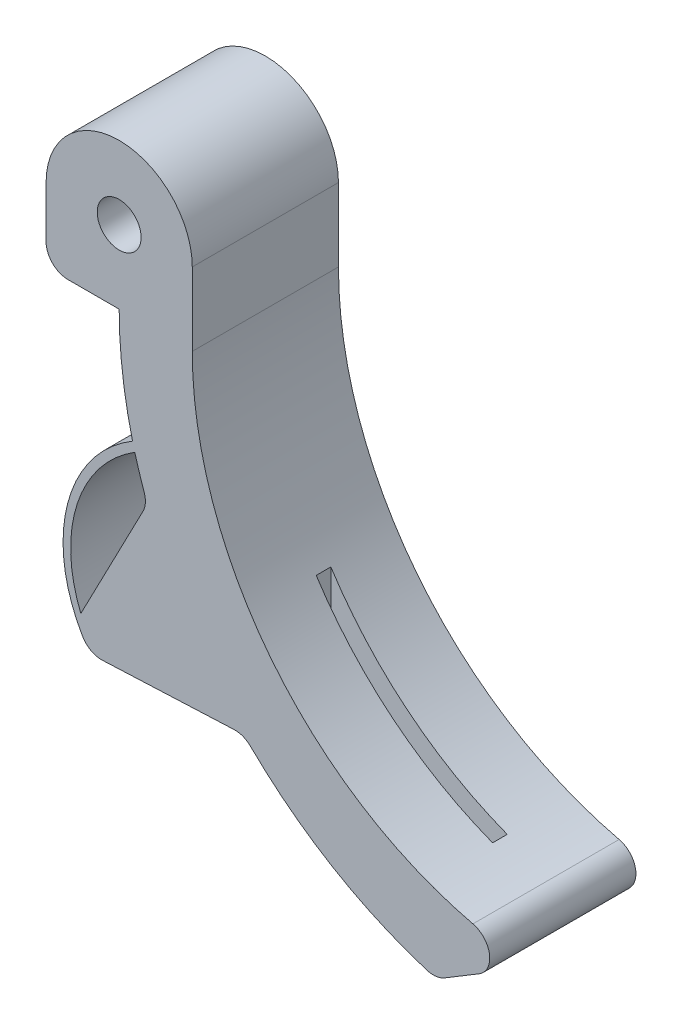
ISO-10303-21;
HEADER;
FILE_DESCRIPTION(('STEP AP214'),'2;1');
FILE_NAME('part.step','',(''),(''),'','','');
FILE_SCHEMA(('AUTOMOTIVE_DESIGN { 1 0 10303 214 1 1 1 1 }'));
ENDSEC;
DATA;
#1=APPLICATION_CONTEXT('core data for automotive mechanical design processes');
#2=APPLICATION_PROTOCOL_DEFINITION('international standard','automotive_design',2000,#1);
#3=PRODUCT_CONTEXT('',#1,'mechanical');
#4=PRODUCT('Part','Part','',(#3));
#5=PRODUCT_RELATED_PRODUCT_CATEGORY('part','',(#4));
#6=PRODUCT_DEFINITION_FORMATION('','',#4);
#7=PRODUCT_DEFINITION_CONTEXT('part definition',#1,'design');
#8=PRODUCT_DEFINITION('design','',#6,#7);
#9=PRODUCT_DEFINITION_SHAPE('','',#8);
#10=(LENGTH_UNIT() NAMED_UNIT(*) SI_UNIT(.MILLI.,.METRE.));
#11=(NAMED_UNIT(*) PLANE_ANGLE_UNIT() SI_UNIT($,.RADIAN.));
#12=(NAMED_UNIT(*) SI_UNIT($,.STERADIAN.) SOLID_ANGLE_UNIT());
#13=UNCERTAINTY_MEASURE_WITH_UNIT(LENGTH_MEASURE(1.E-05),#10,'distance_accuracy_value','');
#14=(GEOMETRIC_REPRESENTATION_CONTEXT(3) GLOBAL_UNCERTAINTY_ASSIGNED_CONTEXT((#13)) GLOBAL_UNIT_ASSIGNED_CONTEXT((#10,
#11,#12)) REPRESENTATION_CONTEXT('',''));
#15=CARTESIAN_POINT('',(0.,0.,0.));
#16=DIRECTION('',(0.,0.,1.));
#17=DIRECTION('',(1.,0.,0.));
#18=AXIS2_PLACEMENT_3D('',#15,#16,#17);
#19=CARTESIAN_POINT('',(30.,-5.,10.));
#20=DIRECTION('',(0.,0.,-1.));
#21=DIRECTION('',(-1.,0.,0.));
#22=AXIS2_PLACEMENT_3D('',#19,#20,#21);
#23=CYLINDRICAL_SURFACE('',#22,29.9999989888262);
#24=CARTESIAN_POINT('',(30.,-5.,10.));
#25=DIRECTION('',(0.,0.,1.));
#26=DIRECTION('',(1.,0.,0.));
#27=AXIS2_PLACEMENT_3D('',#24,#25,#26);
#28=CIRCLE('',#27,29.9999989888262);
#29=CARTESIAN_POINT('',(1.07075540705552,-12.9434719494165,10.));
#30=VERTEX_POINT('',#29);
#31=CARTESIAN_POINT('',(1.70871106394565,-14.9801257339907,10.));
#32=VERTEX_POINT('',#31);
#33=EDGE_CURVE('E56',#30,#32,#28,.T.);
#34=ORIENTED_EDGE('',*,*,#33,.F.);
#35=DIRECTION('',(0.,0.,1.));
#36=VECTOR('',#35,1.);
#37=CARTESIAN_POINT('',(1.07075540705551,-12.9434719494165,0.));
#38=LINE('',#37,#36);
#39=CARTESIAN_POINT('',(1.07075540705551,-12.9434719494165,0.));
#40=VERTEX_POINT('',#39);
#41=EDGE_CURVE('E222',#40,#30,#38,.T.);
#42=ORIENTED_EDGE('',*,*,#41,.F.);
#43=CARTESIAN_POINT('',(30.,-5.,0.));
#44=DIRECTION('',(0.,0.,1.));
#45=DIRECTION('',(1.,0.,0.));
#46=AXIS2_PLACEMENT_3D('',#43,#44,#45);
#47=CIRCLE('',#46,29.9999989888262);
#48=CARTESIAN_POINT('',(1.70871106394565,-14.9801257339907,0.));
#49=VERTEX_POINT('',#48);
#50=EDGE_CURVE('E209',#40,#49,#47,.T.);
#51=ORIENTED_EDGE('',*,*,#50,.T.);
#52=DIRECTION('',(0.,0.,-1.));
#53=VECTOR('',#52,1.);
#54=CARTESIAN_POINT('',(1.70871106394565,-14.9801257339907,10.));
#55=LINE('',#54,#53);
#56=EDGE_CURVE('E386',#49,#32,#55,.F.);
#57=ORIENTED_EDGE('',*,*,#56,.T.);
#58=EDGE_LOOP('',(#34,#42,#51,#57));
#59=FACE_BOUND('',#58,.T.);
#60=ADVANCED_FACE('F38',(#59),#23,.T.);
#61=CARTESIAN_POINT('',(0.,0.,10.));
#62=DIRECTION('',(0.,0.,1.));
#63=DIRECTION('',(1.,0.,0.));
#64=AXIS2_PLACEMENT_3D('',#61,#62,#63);
#65=PLANE('',#64);
#66=CARTESIAN_POINT('',(1.01117377318549E-06,-5.,10.));
#67=VERTEX_POINT('',#66);
#68=CARTESIAN_POINT('',(0.916901566270906,-12.3602530407316,10.));
#69=VERTEX_POINT('',#68);
#70=EDGE_CURVE('E449',#67,#69,#28,.T.);
#71=ORIENTED_EDGE('',*,*,#70,.T.);
#72=CARTESIAN_POINT('',(5.88206845820122,-20.7159915410983,10.));
#73=DIRECTION('',(0.,0.,1.));
#74=DIRECTION('',(1.,0.,0.));
#75=AXIS2_PLACEMENT_3D('',#72,#73,#74);
#76=CIRCLE('',#75,9.71963209958227);
#77=CARTESIAN_POINT('',(-2.53040269958628,-25.5844181011507,10.));
#78=VERTEX_POINT('',#77);
#79=EDGE_CURVE('E235',#69,#78,#76,.T.);
#80=ORIENTED_EDGE('',*,*,#79,.T.);
#81=CARTESIAN_POINT('',(-2.53040269958628,-25.5844181011507,10.));
#82=DIRECTION('',(0.505870849991201,-0.862609229680033,0.));
#83=VECTOR('',#82,1.);
#84=LINE('',#81,#83);
#85=CARTESIAN_POINT('',(-2.47367004216542,-25.6811584330285,10.));
#86=VERTEX_POINT('',#85);
#87=EDGE_CURVE('E12',#78,#86,#84,.T.);
#88=ORIENTED_EDGE('',*,*,#87,.T.);
#89=CARTESIAN_POINT('',(-1.2090269493759,-24.8745123843432,10.));
#90=DIRECTION('',(0.,0.,1.));
#91=DIRECTION('',(1.,0.,0.));
#92=AXIS2_PLACEMENT_3D('',#89,#90,#91);
#93=CIRCLE('',#92,1.5);
#94=CARTESIAN_POINT('',(-1.14277252574677,-26.3730484537621,10.));
#95=VERTEX_POINT('',#94);
#96=EDGE_CURVE('E268',#86,#95,#93,.T.);
#97=ORIENTED_EDGE('',*,*,#96,.T.);
#98=DIRECTION('',(0.999024046279295,0.0441696157527553,0.));
#99=VECTOR('',#98,1.);
#100=CARTESIAN_POINT('',(1.1615210425008,-26.2711692628957,10.));
#101=LINE('',#100,#99);
#102=CARTESIAN_POINT('',(7.86131411609586,-25.9749528837346,10.));
#103=VERTEX_POINT('',#102);
#104=EDGE_CURVE('E466',#95,#103,#101,.T.);
#105=ORIENTED_EDGE('',*,*,#104,.T.);
#106=CARTESIAN_POINT('',(7.92756853972499,-27.4734889531536,10.));
#107=DIRECTION('',(0.,0.,1.));
#108=DIRECTION('',(1.,0.,0.));
#109=AXIS2_PLACEMENT_3D('',#106,#107,#108);
#110=CIRCLE('',#109,1.5);
#111=CARTESIAN_POINT('',(8.97863673824008,-26.4033227781741,10.));
#112=VERTEX_POINT('',#111);
#113=EDGE_CURVE('E244',#103,#112,#110,.F.);
#114=ORIENTED_EDGE('',*,*,#113,.T.);
#115=CARTESIAN_POINT('',(30.,-5.,10.));
#116=DIRECTION('',(0.,0.,1.));
#117=DIRECTION('',(1.,0.,0.));
#118=AXIS2_PLACEMENT_3D('',#115,#116,#117);
#119=CIRCLE('',#118,29.9999989888262);
#120=CARTESIAN_POINT('',(21.0443812891128,-33.6320944542096,10.));
#121=VERTEX_POINT('',#120);
#122=EDGE_CURVE('E463',#112,#121,#119,.T.);
#123=ORIENTED_EDGE('',*,*,#122,.T.);
#124=CARTESIAN_POINT('',(21.49216223975,-32.2004896832458,10.));
#125=DIRECTION('',(0.,0.,1.));
#126=DIRECTION('',(1.,0.,0.));
#127=AXIS2_PLACEMENT_3D('',#124,#125,#126);
#128=CIRCLE('',#127,1.5);
#129=CARTESIAN_POINT('',(22.267894354233,-33.4843275571846,10.));
#130=VERTEX_POINT('',#129);
#131=EDGE_CURVE('E266',#121,#130,#128,.T.);
#132=ORIENTED_EDGE('',*,*,#131,.T.);
#133=DIRECTION('',(-0.855891915959212,-0.517154742988662,0.));
#134=VECTOR('',#133,1.);
#135=CARTESIAN_POINT('',(20.7766465222511,-34.3853827896279,10.));
#136=LINE('',#135,#134);
#137=CARTESIAN_POINT('',(24.624930570523,-32.0601378482722,10.));
#138=VERTEX_POINT('',#137);
#139=EDGE_CURVE('E460',#138,#130,#136,.T.);
#140=ORIENTED_EDGE('',*,*,#139,.F.);
#141=CARTESIAN_POINT('',(23.84919845604,-30.7762999743334,10.));
#142=DIRECTION('',(0.,0.,1.));
#143=DIRECTION('',(1.,0.,0.));
#144=AXIS2_PLACEMENT_3D('',#141,#142,#143);
#145=CIRCLE('',#144,1.5);
#146=CARTESIAN_POINT('',(24.197357034,-29.3172641267296,10.));
#147=VERTEX_POINT('',#146);
#148=EDGE_CURVE('E264',#138,#147,#145,.T.);
#149=ORIENTED_EDGE('',*,*,#148,.T.);
#150=CARTESIAN_POINT('',(30.,-5.,10.));
#151=DIRECTION('',(0.,0.,1.));
#152=DIRECTION('',(1.,0.,0.));
#153=AXIS2_PLACEMENT_3D('',#150,#151,#152);
#154=CIRCLE('',#153,25.);
#155=CARTESIAN_POINT('',(5.,-5.,10.));
#156=VERTEX_POINT('',#155);
#157=EDGE_CURVE('E457',#156,#147,#154,.T.);
#158=ORIENTED_EDGE('',*,*,#157,.F.);
#159=DIRECTION('',(0.,-1.,0.));
#160=VECTOR('',#159,1.);
#161=CARTESIAN_POINT('',(5.,0.,10.));
#162=LINE('',#161,#160);
#163=CARTESIAN_POINT('',(5.,0.,10.));
#164=VERTEX_POINT('',#163);
#165=EDGE_CURVE('E454',#164,#156,#162,.T.);
#166=ORIENTED_EDGE('',*,*,#165,.F.);
#167=CARTESIAN_POINT('',(0.,0.,10.));
#168=DIRECTION('',(0.,0.,1.));
#169=DIRECTION('',(1.,0.,0.));
#170=AXIS2_PLACEMENT_3D('',#167,#168,#169);
#171=CIRCLE('',#170,5.);
#172=CARTESIAN_POINT('',(-5.,0.,10.));
#173=VERTEX_POINT('',#172);
#174=EDGE_CURVE('E452',#164,#173,#171,.T.);
#175=ORIENTED_EDGE('',*,*,#174,.T.);
#176=DIRECTION('',(0.,-1.,0.));
#177=VECTOR('',#176,1.);
#178=CARTESIAN_POINT('',(-5.,0.,10.));
#179=LINE('',#178,#177);
#180=CARTESIAN_POINT('',(-5.,-3.5,10.));
#181=VERTEX_POINT('',#180);
#182=EDGE_CURVE('E401',#173,#181,#179,.T.);
#183=ORIENTED_EDGE('',*,*,#182,.T.);
#184=CARTESIAN_POINT('',(-3.5,-3.5,10.));
#185=DIRECTION('',(0.,0.,1.));
#186=DIRECTION('',(1.,0.,0.));
#187=AXIS2_PLACEMENT_3D('',#184,#185,#186);
#188=CIRCLE('',#187,1.5);
#189=CARTESIAN_POINT('',(-3.5,-5.,10.));
#190=VERTEX_POINT('',#189);
#191=EDGE_CURVE('E273',#181,#190,#188,.T.);
#192=ORIENTED_EDGE('',*,*,#191,.T.);
#193=DIRECTION('',(1.,0.,0.));
#194=VECTOR('',#193,1.);
#195=CARTESIAN_POINT('',(0.,-5.,10.));
#196=LINE('',#195,#194);
#197=EDGE_CURVE('E399',#190,#67,#196,.T.);
#198=ORIENTED_EDGE('',*,*,#197,.T.);
#199=EDGE_LOOP('',(#71,#80,#88,#97,#105,#114,#123,#132,#140,#149,#158,#166,#175,#183,#192,#198));
#200=FACE_BOUND('',#199,.T.);
#201=CARTESIAN_POINT('',(-2.53992446579455,-24.1826223636096,10.));
#202=VERTEX_POINT('',#201);
#203=CARTESIAN_POINT('',(-2.61622547502334,-24.3550970308777,10.));
#204=VERTEX_POINT('',#203);
#205=EDGE_CURVE('E269',#202,#204,#93,.T.);
#206=ORIENTED_EDGE('',*,*,#205,.T.);
#207=CARTESIAN_POINT('',(5.93532338248411,-20.8165904576,10.));
#208=DIRECTION('',(0.,0.,-1.));
#209=DIRECTION('',(1.,0.,0.));
#210=AXIS2_PLACEMENT_3D('',#207,#208,#209);
#211=CIRCLE('',#210,9.2547294196787);
#212=EDGE_CURVE('E232',#204,#30,#211,.T.);
#213=ORIENTED_EDGE('',*,*,#212,.T.);
#214=ORIENTED_EDGE('',*,*,#33,.T.);
#215=CARTESIAN_POINT('',(0.294146569463919,-15.4791320375096,10.));
#216=DIRECTION('',(0.,0.,1.));
#217=DIRECTION('',(1.,0.,0.));
#218=AXIS2_PLACEMENT_3D('',#215,#216,#217);
#219=CIRCLE('',#218,1.5);
#220=CARTESIAN_POINT('',(1.62504408588257,-16.1710220582432,10.));
#221=VERTEX_POINT('',#220);
#222=EDGE_CURVE('E360',#32,#221,#219,.F.);
#223=ORIENTED_EDGE('',*,*,#222,.T.);
#224=DIRECTION('',(-0.461260013822364,-0.887265010945767,0.));
#225=VECTOR('',#224,1.);
#226=CARTESIAN_POINT('',(7.89744881050216,-4.10562492891574,10.));
#227=LINE('',#226,#225);
#228=EDGE_CURVE('E420',#221,#202,#227,.T.);
#229=ORIENTED_EDGE('',*,*,#228,.T.);
#230=EDGE_LOOP('',(#206,#213,#214,#223,#229));
#231=FACE_BOUND('',#230,.T.);
#232=CARTESIAN_POINT('',(0.,0.,10.));
#233=DIRECTION('',(0.,0.,1.));
#234=DIRECTION('',(1.,0.,0.));
#235=AXIS2_PLACEMENT_3D('',#232,#233,#234);
#236=CIRCLE('',#235,1.5);
#237=CARTESIAN_POINT('',(1.5,0.,10.));
#238=VERTEX_POINT('',#237);
#239=EDGE_CURVE('E421',#238,#238,#236,.T.);
#240=ORIENTED_EDGE('',*,*,#239,.F.);
#241=EDGE_LOOP('',(#240));
#242=FACE_BOUND('',#241,.T.);
#243=ADVANCED_FACE('F288',(#200,#231,#242),#65,.T.);
#244=CARTESIAN_POINT('',(0.,0.,0.));
#245=DIRECTION('',(0.,0.,1.));
#246=DIRECTION('',(1.,0.,0.));
#247=AXIS2_PLACEMENT_3D('',#244,#245,#246);
#248=PLANE('',#247);
#249=CARTESIAN_POINT('',(5.88206845820122,-20.7159915410983,0.));
#250=DIRECTION('',(0.,0.,1.));
#251=DIRECTION('',(1.,0.,0.));
#252=AXIS2_PLACEMENT_3D('',#249,#250,#251);
#253=CIRCLE('',#252,9.71963209958227);
#254=CARTESIAN_POINT('',(0.916901566270906,-12.3602530407316,0.));
#255=VERTEX_POINT('',#254);
#256=CARTESIAN_POINT('',(-2.53040269958627,-25.5844181011507,0.));
#257=VERTEX_POINT('',#256);
#258=EDGE_CURVE('E229',#255,#257,#253,.T.);
#259=ORIENTED_EDGE('',*,*,#258,.F.);
#260=CARTESIAN_POINT('',(1.01117377318549E-06,-5.,0.));
#261=VERTEX_POINT('',#260);
#262=EDGE_CURVE('E218',#261,#255,#47,.T.);
#263=ORIENTED_EDGE('',*,*,#262,.F.);
#264=DIRECTION('',(1.,0.,0.));
#265=VECTOR('',#264,1.);
#266=CARTESIAN_POINT('',(0.,-5.,0.));
#267=LINE('',#266,#265);
#268=CARTESIAN_POINT('',(-3.5,-5.,0.));
#269=VERTEX_POINT('',#268);
#270=EDGE_CURVE('E219',#269,#261,#267,.T.);
#271=ORIENTED_EDGE('',*,*,#270,.F.);
#272=CARTESIAN_POINT('',(-3.5,-3.5,0.));
#273=DIRECTION('',(0.,0.,1.));
#274=DIRECTION('',(1.,0.,0.));
#275=AXIS2_PLACEMENT_3D('',#272,#273,#274);
#276=CIRCLE('',#275,1.5);
#277=CARTESIAN_POINT('',(-5.,-3.5,0.));
#278=VERTEX_POINT('',#277);
#279=EDGE_CURVE('E253',#269,#278,#276,.F.);
#280=ORIENTED_EDGE('',*,*,#279,.T.);
#281=DIRECTION('',(0.,-1.,0.));
#282=VECTOR('',#281,1.);
#283=CARTESIAN_POINT('',(-5.,0.,0.));
#284=LINE('',#283,#282);
#285=CARTESIAN_POINT('',(-5.,0.,0.));
#286=VERTEX_POINT('',#285);
#287=EDGE_CURVE('E424',#286,#278,#284,.T.);
#288=ORIENTED_EDGE('',*,*,#287,.F.);
#289=CARTESIAN_POINT('',(0.,0.,0.));
#290=DIRECTION('',(0.,0.,1.));
#291=DIRECTION('',(1.,0.,0.));
#292=AXIS2_PLACEMENT_3D('',#289,#290,#291);
#293=CIRCLE('',#292,5.);
#294=CARTESIAN_POINT('',(5.,0.,0.));
#295=VERTEX_POINT('',#294);
#296=EDGE_CURVE('E427',#295,#286,#293,.T.);
#297=ORIENTED_EDGE('',*,*,#296,.F.);
#298=DIRECTION('',(0.,-1.,0.));
#299=VECTOR('',#298,1.);
#300=CARTESIAN_POINT('',(5.,0.,0.));
#301=LINE('',#300,#299);
#302=CARTESIAN_POINT('',(5.,-5.,0.));
#303=VERTEX_POINT('',#302);
#304=EDGE_CURVE('E429',#295,#303,#301,.T.);
#305=ORIENTED_EDGE('',*,*,#304,.T.);
#306=CARTESIAN_POINT('',(30.,-5.,0.));
#307=DIRECTION('',(0.,0.,1.));
#308=DIRECTION('',(1.,0.,0.));
#309=AXIS2_PLACEMENT_3D('',#306,#307,#308);
#310=CIRCLE('',#309,25.);
#311=CARTESIAN_POINT('',(24.197357034,-29.3172641267296,0.));
#312=VERTEX_POINT('',#311);
#313=EDGE_CURVE('E432',#303,#312,#310,.T.);
#314=ORIENTED_EDGE('',*,*,#313,.T.);
#315=CARTESIAN_POINT('',(23.84919845604,-30.7762999743334,0.));
#316=DIRECTION('',(0.,0.,1.));
#317=DIRECTION('',(1.,0.,0.));
#318=AXIS2_PLACEMENT_3D('',#315,#316,#317);
#319=CIRCLE('',#318,1.5);
#320=CARTESIAN_POINT('',(24.624930570523,-32.0601378482722,0.));
#321=VERTEX_POINT('',#320);
#322=EDGE_CURVE('E409',#312,#321,#319,.F.);
#323=ORIENTED_EDGE('',*,*,#322,.T.);
#324=DIRECTION('',(-0.855891915959212,-0.517154742988662,0.));
#325=VECTOR('',#324,1.);
#326=CARTESIAN_POINT('',(20.7766465222511,-34.3853827896279,0.));
#327=LINE('',#326,#325);
#328=CARTESIAN_POINT('',(22.267894354233,-33.4843275571846,0.));
#329=VERTEX_POINT('',#328);
#330=EDGE_CURVE('E435',#321,#329,#327,.T.);
#331=ORIENTED_EDGE('',*,*,#330,.T.);
#332=CARTESIAN_POINT('',(21.49216223975,-32.2004896832458,0.));
#333=DIRECTION('',(0.,0.,1.));
#334=DIRECTION('',(1.,0.,0.));
#335=AXIS2_PLACEMENT_3D('',#332,#333,#334);
#336=CIRCLE('',#335,1.5);
#337=CARTESIAN_POINT('',(21.0443812891128,-33.6320944542096,0.));
#338=VERTEX_POINT('',#337);
#339=EDGE_CURVE('E259',#329,#338,#336,.F.);
#340=ORIENTED_EDGE('',*,*,#339,.T.);
#341=CARTESIAN_POINT('',(30.,-5.,0.));
#342=DIRECTION('',(0.,0.,1.));
#343=DIRECTION('',(1.,0.,0.));
#344=AXIS2_PLACEMENT_3D('',#341,#342,#343);
#345=CIRCLE('',#344,29.9999989888262);
#346=CARTESIAN_POINT('',(8.97863673824008,-26.4033227781741,0.));
#347=VERTEX_POINT('',#346);
#348=EDGE_CURVE('E438',#347,#338,#345,.T.);
#349=ORIENTED_EDGE('',*,*,#348,.F.);
#350=CARTESIAN_POINT('',(7.92756853972499,-27.4734889531536,0.));
#351=DIRECTION('',(0.,0.,1.));
#352=DIRECTION('',(1.,0.,0.));
#353=AXIS2_PLACEMENT_3D('',#350,#351,#352);
#354=CIRCLE('',#353,1.5);
#355=CARTESIAN_POINT('',(7.86131411609586,-25.9749528837346,0.));
#356=VERTEX_POINT('',#355);
#357=EDGE_CURVE('E358',#347,#356,#354,.T.);
#358=ORIENTED_EDGE('',*,*,#357,.T.);
#359=DIRECTION('',(0.999024046279295,0.0441696157527553,0.));
#360=VECTOR('',#359,1.);
#361=CARTESIAN_POINT('',(1.1615210425008,-26.2711692628957,0.));
#362=LINE('',#361,#360);
#363=CARTESIAN_POINT('',(-1.14277252574677,-26.3730484537621,0.));
#364=VERTEX_POINT('',#363);
#365=EDGE_CURVE('E441',#364,#356,#362,.T.);
#366=ORIENTED_EDGE('',*,*,#365,.F.);
#367=CARTESIAN_POINT('',(-1.2090269493759,-24.8745123843432,0.));
#368=DIRECTION('',(0.,0.,1.));
#369=DIRECTION('',(1.,0.,0.));
#370=AXIS2_PLACEMENT_3D('',#367,#368,#369);
#371=CIRCLE('',#370,1.5);
#372=CARTESIAN_POINT('',(-2.47367004216542,-25.6811584330285,0.));
#373=VERTEX_POINT('',#372);
#374=EDGE_CURVE('E249',#364,#373,#371,.F.);
#375=ORIENTED_EDGE('',*,*,#374,.T.);
#376=CARTESIAN_POINT('',(-2.47367004216543,-25.6811584330285,0.));
#377=DIRECTION('',(-0.505870849991201,0.862609229680033,0.));
#378=VECTOR('',#377,1.);
#379=LINE('',#376,#378);
#380=EDGE_CURVE('E49',#373,#257,#379,.T.);
#381=ORIENTED_EDGE('',*,*,#380,.T.);
#382=EDGE_LOOP('',(#259,#263,#271,#280,#288,#297,#305,#314,#323,#331,#340,#349,#358,#366,#375,#381));
#383=FACE_BOUND('',#382,.T.);
#384=CARTESIAN_POINT('',(5.93532338248411,-20.8165904576,0.));
#385=DIRECTION('',(0.,0.,-1.));
#386=DIRECTION('',(1.,0.,0.));
#387=AXIS2_PLACEMENT_3D('',#384,#385,#386);
#388=CIRCLE('',#387,9.2547294196787);
#389=CARTESIAN_POINT('',(-2.61622547502334,-24.3550970308777,0.));
#390=VERTEX_POINT('',#389);
#391=EDGE_CURVE('E213',#390,#40,#388,.T.);
#392=ORIENTED_EDGE('',*,*,#391,.F.);
#393=CARTESIAN_POINT('',(-2.53992446579455,-24.1826223636096,0.));
#394=VERTEX_POINT('',#393);
#395=EDGE_CURVE('E254',#390,#394,#371,.F.);
#396=ORIENTED_EDGE('',*,*,#395,.T.);
#397=DIRECTION('',(-0.461260013822364,-0.887265010945767,0.));
#398=VECTOR('',#397,1.);
#399=CARTESIAN_POINT('',(7.89744881050216,-4.10562492891574,0.));
#400=LINE('',#399,#398);
#401=CARTESIAN_POINT('',(1.62504408588257,-16.1710220582432,0.));
#402=VERTEX_POINT('',#401);
#403=EDGE_CURVE('E350',#402,#394,#400,.T.);
#404=ORIENTED_EDGE('',*,*,#403,.F.);
#405=CARTESIAN_POINT('',(0.294146569463919,-15.4791320375096,0.));
#406=DIRECTION('',(0.,0.,1.));
#407=DIRECTION('',(1.,0.,0.));
#408=AXIS2_PLACEMENT_3D('',#405,#406,#407);
#409=CIRCLE('',#408,1.5);
#410=EDGE_CURVE('E216',#402,#49,#409,.T.);
#411=ORIENTED_EDGE('',*,*,#410,.T.);
#412=ORIENTED_EDGE('',*,*,#50,.F.);
#413=EDGE_LOOP('',(#392,#396,#404,#411,#412));
#414=FACE_BOUND('',#413,.T.);
#415=CARTESIAN_POINT('',(0.,0.,0.));
#416=DIRECTION('',(0.,0.,1.));
#417=DIRECTION('',(1.,0.,0.));
#418=AXIS2_PLACEMENT_3D('',#415,#416,#417);
#419=CIRCLE('',#418,1.5);
#420=CARTESIAN_POINT('',(1.5,0.,0.));
#421=VERTEX_POINT('',#420);
#422=EDGE_CURVE('E444',#421,#421,#419,.T.);
#423=ORIENTED_EDGE('',*,*,#422,.T.);
#424=EDGE_LOOP('',(#423));
#425=FACE_BOUND('',#424,.T.);
#426=ADVANCED_FACE('F210',(#383,#414,#425),#248,.F.);
#427=CARTESIAN_POINT('',(-1.2090269493759,-24.8745123843432,10.));
#428=DIRECTION('',(0.,0.,-1.));
#429=DIRECTION('',(-1.,0.,0.));
#430=AXIS2_PLACEMENT_3D('',#427,#428,#429);
#431=CYLINDRICAL_SURFACE('',#430,1.5);
#432=DIRECTION('',(0.,0.,1.));
#433=VECTOR('',#432,1.);
#434=CARTESIAN_POINT('',(-2.61622547502334,-24.3550970308777,5.));
#435=LINE('',#434,#433);
#436=EDGE_CURVE('E228',#204,#390,#435,.F.);
#437=ORIENTED_EDGE('',*,*,#436,.F.);
#438=ORIENTED_EDGE('',*,*,#205,.F.);
#439=DIRECTION('',(0.,0.,-1.));
#440=VECTOR('',#439,1.);
#441=CARTESIAN_POINT('',(-2.53992446579455,-24.1826223636096,10.));
#442=LINE('',#441,#440);
#443=EDGE_CURVE('E390',#394,#202,#442,.F.);
#444=ORIENTED_EDGE('',*,*,#443,.F.);
#445=ORIENTED_EDGE('',*,*,#395,.F.);
#446=EDGE_LOOP('',(#437,#438,#444,#445));
#447=FACE_BOUND('',#446,.T.);
#448=ADVANCED_FACE('F306',(#447),#431,.T.);
#449=CARTESIAN_POINT('',(30.,-5.,10.));
#450=DIRECTION('',(0.,0.,-1.));
#451=DIRECTION('',(-1.,0.,0.));
#452=AXIS2_PLACEMENT_3D('',#449,#450,#451);
#453=CYLINDRICAL_SURFACE('',#452,29.9999989888262);
#454=CARTESIAN_POINT('',(30.,-5.,4.5));
#455=DIRECTION('',(0.,0.,1.));
#456=DIRECTION('',(1.,0.,0.));
#457=AXIS2_PLACEMENT_3D('',#454,#455,#456);
#458=CIRCLE('',#457,29.9999989888262);
#459=CARTESIAN_POINT('',(8.97863673824008,-26.4033227781741,4.5));
#460=VERTEX_POINT('',#459);
#461=CARTESIAN_POINT('',(21.0443812891128,-33.6320944542096,4.5));
#462=VERTEX_POINT('',#461);
#463=EDGE_CURVE('E475',#460,#462,#458,.T.);
#464=ORIENTED_EDGE('',*,*,#463,.F.);
#465=DIRECTION('',(0.,0.,-1.));
#466=VECTOR('',#465,1.);
#467=CARTESIAN_POINT('',(8.97863673824008,-26.4033227781741,10.));
#468=LINE('',#467,#466);
#469=EDGE_CURVE('E375',#460,#347,#468,.T.);
#470=ORIENTED_EDGE('',*,*,#469,.T.);
#471=ORIENTED_EDGE('',*,*,#348,.T.);
#472=DIRECTION('',(0.,0.,-1.));
#473=VECTOR('',#472,1.);
#474=CARTESIAN_POINT('',(21.0443812891128,-33.6320944542096,10.));
#475=LINE('',#474,#473);
#476=EDGE_CURVE('E376',#338,#462,#475,.F.);
#477=ORIENTED_EDGE('',*,*,#476,.T.);
#478=EDGE_LOOP('',(#464,#470,#471,#477));
#479=FACE_BOUND('',#478,.T.);
#480=ADVANCED_FACE('F564',(#479),#453,.T.);
#481=CARTESIAN_POINT('',(30.,-5.,5.5));
#482=DIRECTION('',(0.,0.,-1.));
#483=DIRECTION('',(-1.,0.,0.));
#484=AXIS2_PLACEMENT_3D('',#481,#482,#483);
#485=CIRCLE('',#484,29.9999989888262);
#486=CARTESIAN_POINT('',(21.0443812891128,-33.6320944542096,5.5));
#487=VERTEX_POINT('',#486);
#488=CARTESIAN_POINT('',(8.97863673824008,-26.4033227781741,5.5));
#489=VERTEX_POINT('',#488);
#490=EDGE_CURVE('E481',#487,#489,#485,.T.);
#491=ORIENTED_EDGE('',*,*,#490,.F.);
#492=EDGE_CURVE('E380',#487,#121,#475,.F.);
#493=ORIENTED_EDGE('',*,*,#492,.T.);
#494=ORIENTED_EDGE('',*,*,#122,.F.);
#495=EDGE_CURVE('E371',#112,#489,#468,.T.);
#496=ORIENTED_EDGE('',*,*,#495,.T.);
#497=EDGE_LOOP('',(#491,#493,#494,#496));
#498=FACE_BOUND('',#497,.T.);
#499=ADVANCED_FACE('F522',(#498),#453,.T.);
#500=CARTESIAN_POINT('',(30.,-5.,10.));
#501=DIRECTION('',(0.,0.,-1.));
#502=DIRECTION('',(-1.,0.,0.));
#503=AXIS2_PLACEMENT_3D('',#500,#501,#502);
#504=CYLINDRICAL_SURFACE('',#503,25.);
#505=ORIENTED_EDGE('',*,*,#157,.T.);
#506=DIRECTION('',(0.,0.,-1.));
#507=VECTOR('',#506,1.);
#508=CARTESIAN_POINT('',(24.197357034,-29.3172641267296,10.));
#509=LINE('',#508,#507);
#510=EDGE_CURVE('E363',#147,#312,#509,.T.);
#511=ORIENTED_EDGE('',*,*,#510,.T.);
#512=ORIENTED_EDGE('',*,*,#313,.F.);
#513=DIRECTION('',(0.,0.,-1.));
#514=VECTOR('',#513,1.);
#515=CARTESIAN_POINT('',(5.,-5.,10.));
#516=LINE('',#515,#514);
#517=EDGE_CURVE('E410',#156,#303,#516,.T.);
#518=ORIENTED_EDGE('',*,*,#517,.F.);
#519=EDGE_LOOP('',(#505,#511,#512,#518));
#520=FACE_BOUND('',#519,.T.);
#521=CARTESIAN_POINT('',(30.,-5.,4.5));
#522=DIRECTION('',(0.,0.,1.));
#523=DIRECTION('',(1.,0.,0.));
#524=AXIS2_PLACEMENT_3D('',#521,#522,#523);
#525=CIRCLE('',#524,25.);
#526=CARTESIAN_POINT('',(8.97863673824008,-18.5315293524838,4.5));
#527=VERTEX_POINT('',#526);
#528=CARTESIAN_POINT('',(21.0443812891128,-28.3408845913176,4.5));
#529=VERTEX_POINT('',#528);
#530=EDGE_CURVE('E478',#527,#529,#525,.T.);
#531=ORIENTED_EDGE('',*,*,#530,.T.);
#532=DIRECTION('',(0.,0.,-1.));
#533=VECTOR('',#532,1.);
#534=CARTESIAN_POINT('',(21.0443812891128,-28.3408845913176,10.));
#535=LINE('',#534,#533);
#536=CARTESIAN_POINT('',(21.0443812891128,-28.3408845913176,5.5));
#537=VERTEX_POINT('',#536);
#538=EDGE_CURVE('E472',#529,#537,#535,.F.);
#539=ORIENTED_EDGE('',*,*,#538,.T.);
#540=CARTESIAN_POINT('',(30.,-5.,5.5));
#541=DIRECTION('',(0.,0.,-1.));
#542=DIRECTION('',(-1.,0.,0.));
#543=AXIS2_PLACEMENT_3D('',#540,#541,#542);
#544=CIRCLE('',#543,25.);
#545=CARTESIAN_POINT('',(8.97863673824009,-18.5315293524838,5.5));
#546=VERTEX_POINT('',#545);
#547=EDGE_CURVE('E497',#537,#546,#544,.T.);
#548=ORIENTED_EDGE('',*,*,#547,.T.);
#549=DIRECTION('',(0.,0.,-1.));
#550=VECTOR('',#549,1.);
#551=CARTESIAN_POINT('',(8.97863673824009,-18.5315293524838,10.));
#552=LINE('',#551,#550);
#553=EDGE_CURVE('E447',#546,#527,#552,.T.);
#554=ORIENTED_EDGE('',*,*,#553,.T.);
#555=EDGE_LOOP('',(#531,#539,#548,#554));
#556=FACE_BOUND('',#555,.T.);
#557=ADVANCED_FACE('F536',(#520,#556),#504,.F.);
#558=CARTESIAN_POINT('',(1.1615210425008,-26.2711692628957,10.));
#559=DIRECTION('',(-0.0441696157527553,0.999024046279295,0.));
#560=DIRECTION('',(-0.999024046279295,-0.0441696157527553,0.));
#561=AXIS2_PLACEMENT_3D('',#558,#559,#560);
#562=PLANE('',#561);
#563=ORIENTED_EDGE('',*,*,#104,.F.);
#564=DIRECTION('',(0.,0.,-1.));
#565=VECTOR('',#564,1.);
#566=CARTESIAN_POINT('',(-1.14277252574677,-26.3730484537621,10.));
#567=LINE('',#566,#565);
#568=EDGE_CURVE('E381',#95,#364,#567,.T.);
#569=ORIENTED_EDGE('',*,*,#568,.T.);
#570=ORIENTED_EDGE('',*,*,#365,.T.);
#571=DIRECTION('',(0.,0.,1.));
#572=VECTOR('',#571,1.);
#573=CARTESIAN_POINT('',(7.86131411609586,-25.9749528837346,10.));
#574=LINE('',#573,#572);
#575=EDGE_CURVE('E384',#356,#103,#574,.T.);
#576=ORIENTED_EDGE('',*,*,#575,.T.);
#577=EDGE_LOOP('',(#563,#569,#570,#576));
#578=FACE_BOUND('',#577,.T.);
#579=ADVANCED_FACE('F561',(#578),#562,.F.);
#580=CARTESIAN_POINT('',(20.7766465222511,-34.3853827896279,10.));
#581=DIRECTION('',(0.517154742988662,-0.855891915959212,0.));
#582=DIRECTION('',(0.855891915959212,0.517154742988662,0.));
#583=AXIS2_PLACEMENT_3D('',#580,#581,#582);
#584=PLANE('',#583);
#585=ORIENTED_EDGE('',*,*,#139,.T.);
#586=DIRECTION('',(0.,0.,1.));
#587=VECTOR('',#586,1.);
#588=CARTESIAN_POINT('',(22.267894354233,-33.4843275571846,0.));
#589=LINE('',#588,#587);
#590=EDGE_CURVE('E366',#130,#329,#589,.F.);
#591=ORIENTED_EDGE('',*,*,#590,.T.);
#592=ORIENTED_EDGE('',*,*,#330,.F.);
#593=DIRECTION('',(0.,0.,-1.));
#594=VECTOR('',#593,1.);
#595=CARTESIAN_POINT('',(24.624930570523,-32.0601378482722,10.));
#596=LINE('',#595,#594);
#597=EDGE_CURVE('E369',#321,#138,#596,.F.);
#598=ORIENTED_EDGE('',*,*,#597,.T.);
#599=EDGE_LOOP('',(#585,#591,#592,#598));
#600=FACE_BOUND('',#599,.T.);
#601=ADVANCED_FACE('F529',(#600),#584,.T.);
#602=CARTESIAN_POINT('',(5.,0.,10.));
#603=DIRECTION('',(1.,0.,0.));
#604=DIRECTION('',(0.,1.,0.));
#605=AXIS2_PLACEMENT_3D('',#602,#603,#604);
#606=PLANE('',#605);
#607=ORIENTED_EDGE('',*,*,#304,.F.);
#608=DIRECTION('',(0.,0.,-1.));
#609=VECTOR('',#608,1.);
#610=CARTESIAN_POINT('',(5.,0.,10.));
#611=LINE('',#610,#609);
#612=EDGE_CURVE('E412',#164,#295,#611,.T.);
#613=ORIENTED_EDGE('',*,*,#612,.F.);
#614=ORIENTED_EDGE('',*,*,#165,.T.);
#615=ORIENTED_EDGE('',*,*,#517,.T.);
#616=EDGE_LOOP('',(#607,#613,#614,#615));
#617=FACE_BOUND('',#616,.T.);
#618=ADVANCED_FACE('F542',(#617),#606,.T.);
#619=CARTESIAN_POINT('',(0.,0.,10.));
#620=DIRECTION('',(0.,0.,-1.));
#621=DIRECTION('',(-1.,0.,0.));
#622=AXIS2_PLACEMENT_3D('',#619,#620,#621);
#623=CYLINDRICAL_SURFACE('',#622,5.);
#624=ORIENTED_EDGE('',*,*,#296,.T.);
#625=DIRECTION('',(0.,0.,-1.));
#626=VECTOR('',#625,1.);
#627=CARTESIAN_POINT('',(-5.,0.,10.));
#628=LINE('',#627,#626);
#629=EDGE_CURVE('E416',#173,#286,#628,.T.);
#630=ORIENTED_EDGE('',*,*,#629,.F.);
#631=ORIENTED_EDGE('',*,*,#174,.F.);
#632=ORIENTED_EDGE('',*,*,#612,.T.);
#633=EDGE_LOOP('',(#624,#630,#631,#632));
#634=FACE_BOUND('',#633,.T.);
#635=ADVANCED_FACE('F547',(#634),#623,.T.);
#636=CARTESIAN_POINT('',(-5.,0.,10.));
#637=DIRECTION('',(1.,0.,0.));
#638=DIRECTION('',(0.,1.,0.));
#639=AXIS2_PLACEMENT_3D('',#636,#637,#638);
#640=PLANE('',#639);
#641=ORIENTED_EDGE('',*,*,#287,.T.);
#642=DIRECTION('',(0.,0.,-1.));
#643=VECTOR('',#642,1.);
#644=CARTESIAN_POINT('',(-5.,-3.5,10.));
#645=LINE('',#644,#643);
#646=EDGE_CURVE('E262',#278,#181,#645,.F.);
#647=ORIENTED_EDGE('',*,*,#646,.T.);
#648=ORIENTED_EDGE('',*,*,#182,.F.);
#649=ORIENTED_EDGE('',*,*,#629,.T.);
#650=EDGE_LOOP('',(#641,#647,#648,#649));
#651=FACE_BOUND('',#650,.T.);
#652=ADVANCED_FACE('F341',(#651),#640,.F.);
#653=CARTESIAN_POINT('',(0.,-5.,10.));
#654=DIRECTION('',(0.,1.,0.));
#655=DIRECTION('',(-1.,0.,0.));
#656=AXIS2_PLACEMENT_3D('',#653,#654,#655);
#657=PLANE('',#656);
#658=ORIENTED_EDGE('',*,*,#197,.F.);
#659=DIRECTION('',(0.,0.,-1.));
#660=VECTOR('',#659,1.);
#661=CARTESIAN_POINT('',(-3.5,-5.,10.));
#662=LINE('',#661,#660);
#663=EDGE_CURVE('E406',#190,#269,#662,.T.);
#664=ORIENTED_EDGE('',*,*,#663,.T.);
#665=ORIENTED_EDGE('',*,*,#270,.T.);
#666=DIRECTION('',(0.,0.,-1.));
#667=VECTOR('',#666,1.);
#668=CARTESIAN_POINT('',(1.01117377318549E-06,-5.,10.));
#669=LINE('',#668,#667);
#670=EDGE_CURVE('E346',#67,#261,#669,.T.);
#671=ORIENTED_EDGE('',*,*,#670,.F.);
#672=EDGE_LOOP('',(#658,#664,#665,#671));
#673=FACE_BOUND('',#672,.T.);
#674=ADVANCED_FACE('F332',(#673),#657,.F.);
#675=ORIENTED_EDGE('',*,*,#262,.T.);
#676=DIRECTION('',(0.,0.,1.));
#677=VECTOR('',#676,1.);
#678=CARTESIAN_POINT('',(0.916901566270911,-12.3602530407316,0.));
#679=LINE('',#678,#677);
#680=EDGE_CURVE('E64',#255,#69,#679,.T.);
#681=ORIENTED_EDGE('',*,*,#680,.T.);
#682=ORIENTED_EDGE('',*,*,#70,.F.);
#683=ORIENTED_EDGE('',*,*,#670,.T.);
#684=EDGE_LOOP('',(#675,#681,#682,#683));
#685=FACE_BOUND('',#684,.T.);
#686=ADVANCED_FACE('F322',(#685),#23,.T.);
#687=CARTESIAN_POINT('',(0.,0.,10.));
#688=DIRECTION('',(0.,0.,-1.));
#689=DIRECTION('',(-1.,0.,0.));
#690=AXIS2_PLACEMENT_3D('',#687,#688,#689);
#691=CYLINDRICAL_SURFACE('',#690,1.5);
#692=ORIENTED_EDGE('',*,*,#239,.T.);
#693=EDGE_LOOP('',(#692));
#694=FACE_BOUND('',#693,.T.);
#695=ORIENTED_EDGE('',*,*,#422,.F.);
#696=EDGE_LOOP('',(#695));
#697=FACE_BOUND('',#696,.T.);
#698=ADVANCED_FACE('F331',(#694,#697),#691,.F.);
#699=CARTESIAN_POINT('',(7.89744881050216,-4.10562492891574,10.));
#700=DIRECTION('',(0.887265010945767,-0.461260013822364,0.));
#701=DIRECTION('',(0.461260013822364,0.887265010945767,0.));
#702=AXIS2_PLACEMENT_3D('',#699,#700,#701);
#703=PLANE('',#702);
#704=ORIENTED_EDGE('',*,*,#228,.F.);
#705=DIRECTION('',(0.,0.,1.));
#706=VECTOR('',#705,1.);
#707=CARTESIAN_POINT('',(1.62504408588257,-16.1710220582432,0.));
#708=LINE('',#707,#706);
#709=EDGE_CURVE('E388',#221,#402,#708,.F.);
#710=ORIENTED_EDGE('',*,*,#709,.T.);
#711=ORIENTED_EDGE('',*,*,#403,.T.);
#712=ORIENTED_EDGE('',*,*,#443,.T.);
#713=EDGE_LOOP('',(#704,#710,#711,#712));
#714=FACE_BOUND('',#713,.T.);
#715=ADVANCED_FACE('F337',(#714),#703,.F.);
#716=CARTESIAN_POINT('',(-3.5,-3.5,10.));
#717=DIRECTION('',(0.,0.,-1.));
#718=DIRECTION('',(-1.,0.,0.));
#719=AXIS2_PLACEMENT_3D('',#716,#717,#718);
#720=CYLINDRICAL_SURFACE('',#719,1.5);
#721=ORIENTED_EDGE('',*,*,#191,.F.);
#722=ORIENTED_EDGE('',*,*,#646,.F.);
#723=ORIENTED_EDGE('',*,*,#279,.F.);
#724=ORIENTED_EDGE('',*,*,#663,.F.);
#725=EDGE_LOOP('',(#721,#722,#723,#724));
#726=FACE_BOUND('',#725,.T.);
#727=ADVANCED_FACE('F408',(#726),#720,.T.);
#728=CARTESIAN_POINT('',(0.294146569463919,-15.4791320375096,10.));
#729=DIRECTION('',(0.,0.,-1.));
#730=DIRECTION('',(-1.,0.,0.));
#731=AXIS2_PLACEMENT_3D('',#728,#729,#730);
#732=CYLINDRICAL_SURFACE('',#731,1.5);
#733=ORIENTED_EDGE('',*,*,#222,.F.);
#734=ORIENTED_EDGE('',*,*,#56,.F.);
#735=ORIENTED_EDGE('',*,*,#410,.F.);
#736=ORIENTED_EDGE('',*,*,#709,.F.);
#737=EDGE_LOOP('',(#733,#734,#735,#736));
#738=FACE_BOUND('',#737,.T.);
#739=ADVANCED_FACE('F305',(#738),#732,.F.);
#740=ORIENTED_EDGE('',*,*,#380,.F.);
#741=ORIENTED_EDGE('',*,*,#374,.F.);
#742=ORIENTED_EDGE('',*,*,#568,.F.);
#743=ORIENTED_EDGE('',*,*,#96,.F.);
#744=ORIENTED_EDGE('',*,*,#87,.F.);
#745=DIRECTION('',(0.,0.,1.));
#746=VECTOR('',#745,1.);
#747=CARTESIAN_POINT('',(-2.53040269958628,-25.5844181011506,5.));
#748=LINE('',#747,#746);
#749=EDGE_CURVE('E240',#257,#78,#748,.T.);
#750=ORIENTED_EDGE('',*,*,#749,.F.);
#751=EDGE_LOOP('',(#740,#741,#742,#743,#744,#750));
#752=FACE_BOUND('',#751,.T.);
#753=ADVANCED_FACE('F285',(#752),#431,.T.);
#754=CARTESIAN_POINT('',(7.92756853972499,-27.4734889531536,10.));
#755=DIRECTION('',(0.,0.,-1.));
#756=DIRECTION('',(-1.,0.,0.));
#757=AXIS2_PLACEMENT_3D('',#754,#755,#756);
#758=CYLINDRICAL_SURFACE('',#757,1.5);
#759=ORIENTED_EDGE('',*,*,#113,.F.);
#760=ORIENTED_EDGE('',*,*,#575,.F.);
#761=ORIENTED_EDGE('',*,*,#357,.F.);
#762=ORIENTED_EDGE('',*,*,#469,.F.);
#763=EDGE_CURVE('E374',#489,#460,#468,.T.);
#764=ORIENTED_EDGE('',*,*,#763,.F.);
#765=ORIENTED_EDGE('',*,*,#495,.F.);
#766=EDGE_LOOP('',(#759,#760,#761,#762,#764,#765));
#767=FACE_BOUND('',#766,.T.);
#768=ADVANCED_FACE('F304',(#767),#758,.F.);
#769=CARTESIAN_POINT('',(21.49216223975,-32.2004896832458,10.));
#770=DIRECTION('',(0.,0.,-1.));
#771=DIRECTION('',(-1.,0.,0.));
#772=AXIS2_PLACEMENT_3D('',#769,#770,#771);
#773=CYLINDRICAL_SURFACE('',#772,1.5);
#774=ORIENTED_EDGE('',*,*,#131,.F.);
#775=ORIENTED_EDGE('',*,*,#492,.F.);
#776=EDGE_CURVE('E379',#462,#487,#475,.F.);
#777=ORIENTED_EDGE('',*,*,#776,.F.);
#778=ORIENTED_EDGE('',*,*,#476,.F.);
#779=ORIENTED_EDGE('',*,*,#339,.F.);
#780=ORIENTED_EDGE('',*,*,#590,.F.);
#781=EDGE_LOOP('',(#774,#775,#777,#778,#779,#780));
#782=FACE_BOUND('',#781,.T.);
#783=ADVANCED_FACE('F310',(#782),#773,.T.);
#784=CARTESIAN_POINT('',(23.84919845604,-30.7762999743334,10.));
#785=DIRECTION('',(0.,0.,-1.));
#786=DIRECTION('',(-1.,0.,0.));
#787=AXIS2_PLACEMENT_3D('',#784,#785,#786);
#788=CYLINDRICAL_SURFACE('',#787,1.5);
#789=ORIENTED_EDGE('',*,*,#148,.F.);
#790=ORIENTED_EDGE('',*,*,#597,.F.);
#791=ORIENTED_EDGE('',*,*,#322,.F.);
#792=ORIENTED_EDGE('',*,*,#510,.F.);
#793=EDGE_LOOP('',(#789,#790,#791,#792));
#794=FACE_BOUND('',#793,.T.);
#795=ADVANCED_FACE('F40',(#794),#788,.T.);
#796=CARTESIAN_POINT('',(8.97863673824008,-26.4033227781741,5.5));
#797=DIRECTION('',(1.,0.,0.));
#798=DIRECTION('',(0.,0.,-1.));
#799=AXIS2_PLACEMENT_3D('',#796,#797,#798);
#800=PLANE('',#799);
#801=DIRECTION('',(0.,1.,0.));
#802=VECTOR('',#801,1.);
#803=CARTESIAN_POINT('',(8.97863673824008,-26.4033227781741,5.5));
#804=LINE('',#803,#802);
#805=EDGE_CURVE('E486',#489,#546,#804,.T.);
#806=ORIENTED_EDGE('',*,*,#805,.F.);
#807=ORIENTED_EDGE('',*,*,#763,.T.);
#808=DIRECTION('',(0.,1.,0.));
#809=VECTOR('',#808,1.);
#810=CARTESIAN_POINT('',(8.97863673824008,-26.4033227781741,4.5));
#811=LINE('',#810,#809);
#812=EDGE_CURVE('E482',#460,#527,#811,.T.);
#813=ORIENTED_EDGE('',*,*,#812,.T.);
#814=ORIENTED_EDGE('',*,*,#553,.F.);
#815=EDGE_LOOP('',(#806,#807,#813,#814));
#816=FACE_BOUND('',#815,.T.);
#817=ADVANCED_FACE('F317',(#816),#800,.T.);
#818=CARTESIAN_POINT('',(21.0443812891128,-33.6320944542096,4.5));
#819=DIRECTION('',(0.,0.,1.));
#820=DIRECTION('',(1.,0.,0.));
#821=AXIS2_PLACEMENT_3D('',#818,#819,#820);
#822=PLANE('',#821);
#823=ORIENTED_EDGE('',*,*,#463,.T.);
#824=DIRECTION('',(0.,1.,0.));
#825=VECTOR('',#824,1.);
#826=CARTESIAN_POINT('',(21.0443812891128,-33.6320944542096,4.5));
#827=LINE('',#826,#825);
#828=EDGE_CURVE('E224',#462,#529,#827,.T.);
#829=ORIENTED_EDGE('',*,*,#828,.T.);
#830=ORIENTED_EDGE('',*,*,#530,.F.);
#831=ORIENTED_EDGE('',*,*,#812,.F.);
#832=EDGE_LOOP('',(#823,#829,#830,#831));
#833=FACE_BOUND('',#832,.T.);
#834=ADVANCED_FACE('F585',(#833),#822,.T.);
#835=CARTESIAN_POINT('',(21.0443812891128,-33.6320944542096,5.5));
#836=DIRECTION('',(0.,0.,-1.));
#837=DIRECTION('',(-1.,0.,0.));
#838=AXIS2_PLACEMENT_3D('',#835,#836,#837);
#839=PLANE('',#838);
#840=ORIENTED_EDGE('',*,*,#490,.T.);
#841=ORIENTED_EDGE('',*,*,#805,.T.);
#842=ORIENTED_EDGE('',*,*,#547,.F.);
#843=DIRECTION('',(0.,1.,0.));
#844=VECTOR('',#843,1.);
#845=CARTESIAN_POINT('',(21.0443812891128,-33.6320944542096,5.5));
#846=LINE('',#845,#844);
#847=EDGE_CURVE('E487',#487,#537,#846,.T.);
#848=ORIENTED_EDGE('',*,*,#847,.F.);
#849=EDGE_LOOP('',(#840,#841,#842,#848));
#850=FACE_BOUND('',#849,.T.);
#851=ADVANCED_FACE('F510',(#850),#839,.T.);
#852=CARTESIAN_POINT('',(21.0443812891128,-33.6320944542096,5.5));
#853=DIRECTION('',(-1.,0.,0.));
#854=DIRECTION('',(0.,0.,1.));
#855=AXIS2_PLACEMENT_3D('',#852,#853,#854);
#856=PLANE('',#855);
#857=ORIENTED_EDGE('',*,*,#828,.F.);
#858=ORIENTED_EDGE('',*,*,#776,.T.);
#859=ORIENTED_EDGE('',*,*,#847,.T.);
#860=ORIENTED_EDGE('',*,*,#538,.F.);
#861=EDGE_LOOP('',(#857,#858,#859,#860));
#862=FACE_BOUND('',#861,.T.);
#863=ADVANCED_FACE('F584',(#862),#856,.T.);
#864=CARTESIAN_POINT('',(5.93532338248411,-20.8165904576,0.));
#865=DIRECTION('',(0.,0.,1.));
#866=DIRECTION('',(1.,0.,0.));
#867=AXIS2_PLACEMENT_3D('',#864,#865,#866);
#868=CYLINDRICAL_SURFACE('',#867,9.2547294196787);
#869=ORIENTED_EDGE('',*,*,#212,.F.);
#870=ORIENTED_EDGE('',*,*,#436,.T.);
#871=ORIENTED_EDGE('',*,*,#391,.T.);
#872=ORIENTED_EDGE('',*,*,#41,.T.);
#873=EDGE_LOOP('',(#869,#870,#871,#872));
#874=FACE_BOUND('',#873,.T.);
#875=ADVANCED_FACE('F226',(#874),#868,.F.);
#876=CARTESIAN_POINT('',(5.88206845820122,-20.7159915410983,0.));
#877=DIRECTION('',(0.,0.,1.));
#878=DIRECTION('',(1.,0.,0.));
#879=AXIS2_PLACEMENT_3D('',#876,#877,#878);
#880=CYLINDRICAL_SURFACE('',#879,9.71963209958227);
#881=ORIENTED_EDGE('',*,*,#258,.T.);
#882=ORIENTED_EDGE('',*,*,#749,.T.);
#883=ORIENTED_EDGE('',*,*,#79,.F.);
#884=ORIENTED_EDGE('',*,*,#680,.F.);
#885=EDGE_LOOP('',(#881,#882,#883,#884));
#886=FACE_BOUND('',#885,.T.);
#887=ADVANCED_FACE('F352',(#886),#880,.T.);
#888=CLOSED_SHELL('',(#60,#243,#426,#448,#480,#499,#557,#579,#601,#618,#635,#652,#674,#686,#698,
#715,#727,#739,#753,#768,#783,#795,#817,#834,#851,#863,#875,#887));
#889=MANIFOLD_SOLID_BREP('B2',#888);
#890=ADVANCED_BREP_SHAPE_REPRESENTATION('',(#18,#889),#14);
#891=SHAPE_DEFINITION_REPRESENTATION(#9,#890);
ENDSEC;
END-ISO-10303-21;
